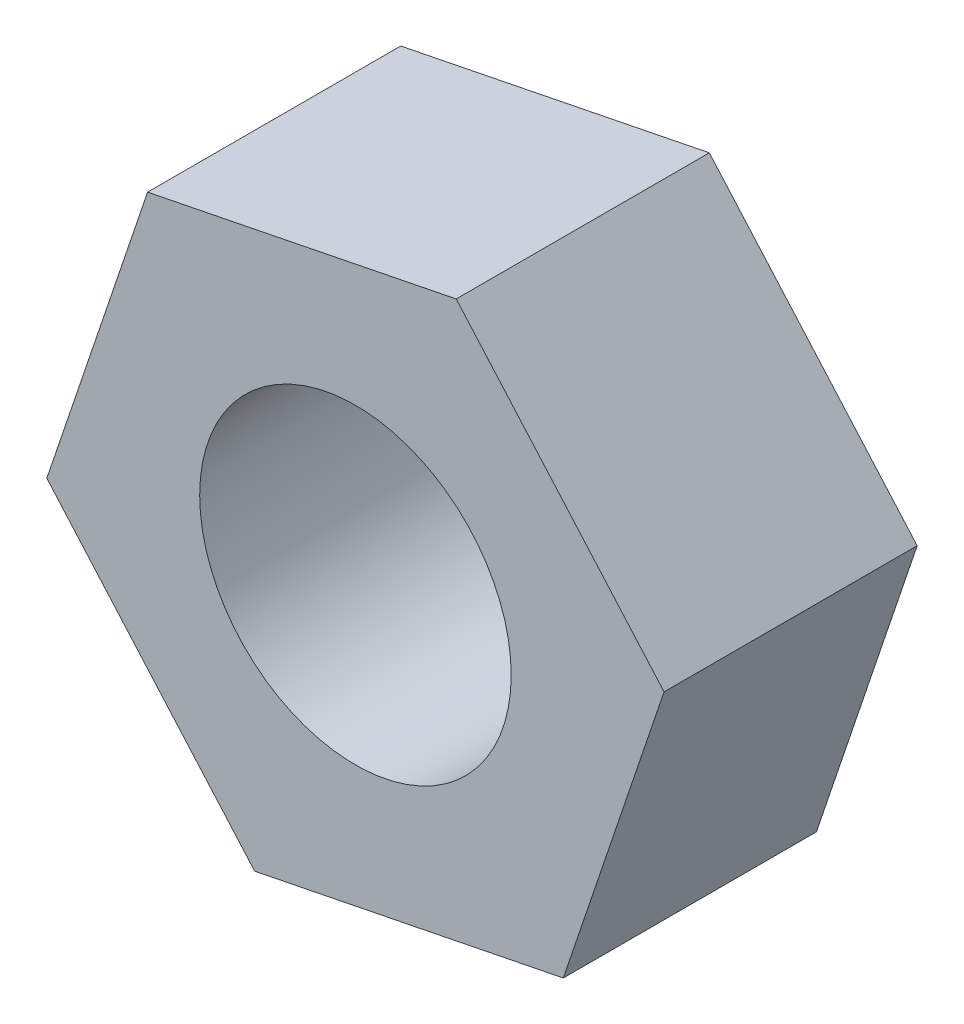
ISO-10303-21;
HEADER;
FILE_DESCRIPTION(('STEP AP214'),'2;1');
FILE_NAME('part.step','',(''),(''),'','','');
FILE_SCHEMA(('AUTOMOTIVE_DESIGN { 1 0 10303 214 1 1 1 1 }'));
ENDSEC;
DATA;
#1=APPLICATION_CONTEXT('core data for automotive mechanical design processes');
#2=APPLICATION_PROTOCOL_DEFINITION('international standard','automotive_design',2000,#1);
#3=PRODUCT_CONTEXT('',#1,'mechanical');
#4=PRODUCT('Part','Part','',(#3));
#5=PRODUCT_RELATED_PRODUCT_CATEGORY('part','',(#4));
#6=PRODUCT_DEFINITION_FORMATION('','',#4);
#7=PRODUCT_DEFINITION_CONTEXT('part definition',#1,'design');
#8=PRODUCT_DEFINITION('design','',#6,#7);
#9=PRODUCT_DEFINITION_SHAPE('','',#8);
#10=(LENGTH_UNIT() NAMED_UNIT(*) SI_UNIT(.MILLI.,.METRE.));
#11=(NAMED_UNIT(*) PLANE_ANGLE_UNIT() SI_UNIT($,.RADIAN.));
#12=(NAMED_UNIT(*) SI_UNIT($,.STERADIAN.) SOLID_ANGLE_UNIT());
#13=UNCERTAINTY_MEASURE_WITH_UNIT(LENGTH_MEASURE(1.E-05),#10,'distance_accuracy_value','');
#14=(GEOMETRIC_REPRESENTATION_CONTEXT(3) GLOBAL_UNCERTAINTY_ASSIGNED_CONTEXT((#13)) GLOBAL_UNIT_ASSIGNED_CONTEXT((#10,
#11,#12)) REPRESENTATION_CONTEXT('',''));
#15=CARTESIAN_POINT('',(0.,0.,0.));
#16=DIRECTION('',(0.,0.,1.));
#17=DIRECTION('',(1.,0.,0.));
#18=AXIS2_PLACEMENT_3D('',#15,#16,#17);
#19=CARTESIAN_POINT('',(420.,-100.000000000005,911.5));
#20=DIRECTION('',(0.,0.,-1.));
#21=DIRECTION('',(-1.,0.,0.));
#22=AXIS2_PLACEMENT_3D('',#19,#20,#21);
#23=PLANE('',#22);
#24=DIRECTION('',(-0.980523085240555,-0.196403867859939,0.));
#25=VECTOR('',#24,1.);
#26=CARTESIAN_POINT('',(425.337563945491,-106.069904814837,911.5));
#27=LINE('',#26,#25);
#28=CARTESIAN_POINT('',(425.337563945491,-106.069904814837,911.5));
#29=VERTEX_POINT('',#28);
#30=CARTESIAN_POINT('',(417.412090204548,-107.657418378541,911.5));
#31=VERTEX_POINT('',#30);
#32=EDGE_CURVE('E112',#29,#31,#27,.T.);
#33=ORIENTED_EDGE('',*,*,#32,.T.);
#34=DIRECTION('',(-0.660352281588506,0.750955966885446,0.));
#35=VECTOR('',#34,1.);
#36=CARTESIAN_POINT('',(417.412090204548,-107.657418378541,911.5));
#37=LINE('',#36,#35);
#38=CARTESIAN_POINT('',(412.074526259056,-101.587513563708,911.5));
#39=VERTEX_POINT('',#38);
#40=EDGE_CURVE('E70',#31,#39,#37,.T.);
#41=ORIENTED_EDGE('',*,*,#40,.T.);
#42=DIRECTION('',(0.320170803652048,0.947359834745384,0.));
#43=VECTOR('',#42,1.);
#44=CARTESIAN_POINT('',(412.074526259056,-101.587513563708,911.5));
#45=LINE('',#44,#43);
#46=CARTESIAN_POINT('',(414.662436054508,-93.9300951851728,911.5));
#47=VERTEX_POINT('',#46);
#48=EDGE_CURVE('E83',#39,#47,#45,.T.);
#49=ORIENTED_EDGE('',*,*,#48,.T.);
#50=DIRECTION('',(0.980523085240555,0.196403867859939,0.));
#51=VECTOR('',#50,1.);
#52=CARTESIAN_POINT('',(414.662436054508,-93.9300951851728,911.5));
#53=LINE('',#52,#51);
#54=CARTESIAN_POINT('',(422.587909795452,-92.3425816214693,911.5));
#55=VERTEX_POINT('',#54);
#56=EDGE_CURVE('E77',#47,#55,#53,.T.);
#57=ORIENTED_EDGE('',*,*,#56,.T.);
#58=DIRECTION('',(0.660352281588506,-0.750955966885446,0.));
#59=VECTOR('',#58,1.);
#60=CARTESIAN_POINT('',(422.587909795452,-92.3425816214693,911.5));
#61=LINE('',#60,#59);
#62=CARTESIAN_POINT('',(427.925473740944,-98.4124864363015,911.5));
#63=VERTEX_POINT('',#62);
#64=EDGE_CURVE('E81',#55,#63,#61,.T.);
#65=ORIENTED_EDGE('',*,*,#64,.T.);
#66=DIRECTION('',(-0.320170803652048,-0.947359834745384,0.));
#67=VECTOR('',#66,1.);
#68=CARTESIAN_POINT('',(427.925473740944,-98.4124864363015,911.5));
#69=LINE('',#68,#67);
#70=EDGE_CURVE('E33',#63,#29,#69,.T.);
#71=ORIENTED_EDGE('',*,*,#70,.T.);
#72=EDGE_LOOP('',(#33,#41,#49,#57,#65,#71));
#73=FACE_BOUND('',#72,.T.);
#74=CARTESIAN_POINT('',(420.,-100.000000000005,911.5));
#75=DIRECTION('',(0.,0.,-1.));
#76=DIRECTION('',(-1.,0.,0.));
#77=AXIS2_PLACEMENT_3D('',#74,#75,#76);
#78=CIRCLE('',#77,4.);
#79=CARTESIAN_POINT('',(416.,-100.000000000005,911.5));
#80=VERTEX_POINT('',#79);
#81=EDGE_CURVE('E105',#80,#80,#78,.T.);
#82=ORIENTED_EDGE('',*,*,#81,.F.);
#83=EDGE_LOOP('',(#82));
#84=FACE_BOUND('',#83,.T.);
#85=ADVANCED_FACE('F16',(#73,#84),#23,.T.);
#86=CARTESIAN_POINT('',(420.,-100.000000000005,918.));
#87=DIRECTION('',(0.,0.,-1.));
#88=DIRECTION('',(-1.,0.,0.));
#89=AXIS2_PLACEMENT_3D('',#86,#87,#88);
#90=PLANE('',#89);
#91=DIRECTION('',(-0.980523085240555,-0.196403867859939,0.));
#92=VECTOR('',#91,1.);
#93=CARTESIAN_POINT('',(425.337563945491,-106.069904814837,918.));
#94=LINE('',#93,#92);
#95=CARTESIAN_POINT('',(425.337563945491,-106.069904814837,918.));
#96=VERTEX_POINT('',#95);
#97=CARTESIAN_POINT('',(417.412090204548,-107.657418378541,918.));
#98=VERTEX_POINT('',#97);
#99=EDGE_CURVE('E101',#96,#98,#94,.T.);
#100=ORIENTED_EDGE('',*,*,#99,.F.);
#101=DIRECTION('',(-0.320170803652048,-0.947359834745384,0.));
#102=VECTOR('',#101,1.);
#103=CARTESIAN_POINT('',(427.925473740944,-98.4124864363015,918.));
#104=LINE('',#103,#102);
#105=CARTESIAN_POINT('',(427.925473740944,-98.4124864363015,918.));
#106=VERTEX_POINT('',#105);
#107=EDGE_CURVE('E62',#106,#96,#104,.T.);
#108=ORIENTED_EDGE('',*,*,#107,.F.);
#109=DIRECTION('',(0.660352281588506,-0.750955966885446,0.));
#110=VECTOR('',#109,1.);
#111=CARTESIAN_POINT('',(422.587909795452,-92.3425816214693,918.));
#112=LINE('',#111,#110);
#113=CARTESIAN_POINT('',(422.587909795452,-92.3425816214693,918.));
#114=VERTEX_POINT('',#113);
#115=EDGE_CURVE('E56',#114,#106,#112,.T.);
#116=ORIENTED_EDGE('',*,*,#115,.F.);
#117=DIRECTION('',(0.980523085240555,0.196403867859939,0.));
#118=VECTOR('',#117,1.);
#119=CARTESIAN_POINT('',(414.662436054508,-93.9300951851728,918.));
#120=LINE('',#119,#118);
#121=CARTESIAN_POINT('',(414.662436054508,-93.9300951851728,918.));
#122=VERTEX_POINT('',#121);
#123=EDGE_CURVE('E91',#122,#114,#120,.T.);
#124=ORIENTED_EDGE('',*,*,#123,.F.);
#125=DIRECTION('',(0.320170803652048,0.947359834745384,0.));
#126=VECTOR('',#125,1.);
#127=CARTESIAN_POINT('',(412.074526259056,-101.587513563708,918.));
#128=LINE('',#127,#126);
#129=CARTESIAN_POINT('',(412.074526259056,-101.587513563708,918.));
#130=VERTEX_POINT('',#129);
#131=EDGE_CURVE('E107',#130,#122,#128,.T.);
#132=ORIENTED_EDGE('',*,*,#131,.F.);
#133=DIRECTION('',(-0.660352281588506,0.750955966885446,0.));
#134=VECTOR('',#133,1.);
#135=CARTESIAN_POINT('',(417.412090204548,-107.657418378541,918.));
#136=LINE('',#135,#134);
#137=EDGE_CURVE('E104',#98,#130,#136,.T.);
#138=ORIENTED_EDGE('',*,*,#137,.F.);
#139=EDGE_LOOP('',(#100,#108,#116,#124,#132,#138));
#140=FACE_BOUND('',#139,.T.);
#141=CARTESIAN_POINT('',(420.,-100.000000000005,918.));
#142=DIRECTION('',(0.,0.,-1.));
#143=DIRECTION('',(-1.,0.,0.));
#144=AXIS2_PLACEMENT_3D('',#141,#142,#143);
#145=CIRCLE('',#144,4.);
#146=CARTESIAN_POINT('',(416.,-100.000000000005,918.));
#147=VERTEX_POINT('',#146);
#148=EDGE_CURVE('E213',#147,#147,#145,.T.);
#149=ORIENTED_EDGE('',*,*,#148,.T.);
#150=EDGE_LOOP('',(#149));
#151=FACE_BOUND('',#150,.T.);
#152=ADVANCED_FACE('F121',(#140,#151),#90,.F.);
#153=CARTESIAN_POINT('',(425.337563945491,-106.069904814837,911.5));
#154=DIRECTION('',(-0.196403867859939,0.980523085240555,0.));
#155=DIRECTION('',(0.980523085240555,0.196403867859939,0.));
#156=AXIS2_PLACEMENT_3D('',#153,#154,#155);
#157=PLANE('',#156);
#158=ORIENTED_EDGE('',*,*,#99,.T.);
#159=DIRECTION('',(0.,0.,1.));
#160=VECTOR('',#159,1.);
#161=CARTESIAN_POINT('',(417.412090204548,-107.657418378541,911.5));
#162=LINE('',#161,#160);
#163=EDGE_CURVE('E11',#31,#98,#162,.T.);
#164=ORIENTED_EDGE('',*,*,#163,.F.);
#165=ORIENTED_EDGE('',*,*,#32,.F.);
#166=DIRECTION('',(0.,0.,1.));
#167=VECTOR('',#166,1.);
#168=CARTESIAN_POINT('',(425.337563945491,-106.069904814837,911.5));
#169=LINE('',#168,#167);
#170=EDGE_CURVE('E97',#29,#96,#169,.T.);
#171=ORIENTED_EDGE('',*,*,#170,.T.);
#172=EDGE_LOOP('',(#158,#164,#165,#171));
#173=FACE_BOUND('',#172,.T.);
#174=ADVANCED_FACE('F18',(#173),#157,.F.);
#175=CARTESIAN_POINT('',(417.412090204548,-107.657418378541,911.5));
#176=DIRECTION('',(0.750955966885446,0.660352281588506,0.));
#177=DIRECTION('',(0.660352281588506,-0.750955966885446,0.));
#178=AXIS2_PLACEMENT_3D('',#175,#176,#177);
#179=PLANE('',#178);
#180=ORIENTED_EDGE('',*,*,#137,.T.);
#181=DIRECTION('',(0.,0.,1.));
#182=VECTOR('',#181,1.);
#183=CARTESIAN_POINT('',(412.074526259056,-101.587513563708,911.5));
#184=LINE('',#183,#182);
#185=EDGE_CURVE('E25',#39,#130,#184,.T.);
#186=ORIENTED_EDGE('',*,*,#185,.F.);
#187=ORIENTED_EDGE('',*,*,#40,.F.);
#188=ORIENTED_EDGE('',*,*,#163,.T.);
#189=EDGE_LOOP('',(#180,#186,#187,#188));
#190=FACE_BOUND('',#189,.T.);
#191=ADVANCED_FACE('F147',(#190),#179,.F.);
#192=CARTESIAN_POINT('',(412.074526259056,-101.587513563708,911.5));
#193=DIRECTION('',(0.947359834745384,-0.320170803652048,0.));
#194=DIRECTION('',(-0.320170803652048,-0.947359834745384,0.));
#195=AXIS2_PLACEMENT_3D('',#192,#193,#194);
#196=PLANE('',#195);
#197=ORIENTED_EDGE('',*,*,#131,.T.);
#198=DIRECTION('',(0.,0.,1.));
#199=VECTOR('',#198,1.);
#200=CARTESIAN_POINT('',(414.662436054508,-93.9300951851728,911.5));
#201=LINE('',#200,#199);
#202=EDGE_CURVE('E92',#47,#122,#201,.T.);
#203=ORIENTED_EDGE('',*,*,#202,.F.);
#204=ORIENTED_EDGE('',*,*,#48,.F.);
#205=ORIENTED_EDGE('',*,*,#185,.T.);
#206=EDGE_LOOP('',(#197,#203,#204,#205));
#207=FACE_BOUND('',#206,.T.);
#208=ADVANCED_FACE('F118',(#207),#196,.F.);
#209=CARTESIAN_POINT('',(414.662436054508,-93.9300951851728,911.5));
#210=DIRECTION('',(0.196403867859939,-0.980523085240555,0.));
#211=DIRECTION('',(-0.980523085240555,-0.196403867859939,0.));
#212=AXIS2_PLACEMENT_3D('',#209,#210,#211);
#213=PLANE('',#212);
#214=ORIENTED_EDGE('',*,*,#123,.T.);
#215=DIRECTION('',(0.,0.,1.));
#216=VECTOR('',#215,1.);
#217=CARTESIAN_POINT('',(422.587909795452,-92.3425816214693,911.5));
#218=LINE('',#217,#216);
#219=EDGE_CURVE('E88',#55,#114,#218,.T.);
#220=ORIENTED_EDGE('',*,*,#219,.F.);
#221=ORIENTED_EDGE('',*,*,#56,.F.);
#222=ORIENTED_EDGE('',*,*,#202,.T.);
#223=EDGE_LOOP('',(#214,#220,#221,#222));
#224=FACE_BOUND('',#223,.T.);
#225=ADVANCED_FACE('F89',(#224),#213,.F.);
#226=CARTESIAN_POINT('',(422.587909795452,-92.3425816214693,911.5));
#227=DIRECTION('',(-0.750955966885446,-0.660352281588506,0.));
#228=DIRECTION('',(-0.660352281588506,0.750955966885446,0.));
#229=AXIS2_PLACEMENT_3D('',#226,#227,#228);
#230=PLANE('',#229);
#231=ORIENTED_EDGE('',*,*,#115,.T.);
#232=DIRECTION('',(0.,0.,1.));
#233=VECTOR('',#232,1.);
#234=CARTESIAN_POINT('',(427.925473740944,-98.4124864363015,911.5));
#235=LINE('',#234,#233);
#236=EDGE_CURVE('E93',#63,#106,#235,.T.);
#237=ORIENTED_EDGE('',*,*,#236,.F.);
#238=ORIENTED_EDGE('',*,*,#64,.F.);
#239=ORIENTED_EDGE('',*,*,#219,.T.);
#240=EDGE_LOOP('',(#231,#237,#238,#239));
#241=FACE_BOUND('',#240,.T.);
#242=ADVANCED_FACE('F95',(#241),#230,.F.);
#243=CARTESIAN_POINT('',(427.925473740944,-98.4124864363015,911.5));
#244=DIRECTION('',(-0.947359834745384,0.320170803652048,0.));
#245=DIRECTION('',(0.320170803652048,0.947359834745384,0.));
#246=AXIS2_PLACEMENT_3D('',#243,#244,#245);
#247=PLANE('',#246);
#248=ORIENTED_EDGE('',*,*,#107,.T.);
#249=ORIENTED_EDGE('',*,*,#170,.F.);
#250=ORIENTED_EDGE('',*,*,#70,.F.);
#251=ORIENTED_EDGE('',*,*,#236,.T.);
#252=EDGE_LOOP('',(#248,#249,#250,#251));
#253=FACE_BOUND('',#252,.T.);
#254=ADVANCED_FACE('F126',(#253),#247,.F.);
#255=CARTESIAN_POINT('',(420.,-100.000000000005,911.5));
#256=DIRECTION('',(0.,0.,1.));
#257=DIRECTION('',(1.,0.,0.));
#258=AXIS2_PLACEMENT_3D('',#255,#256,#257);
#259=CYLINDRICAL_SURFACE('',#258,4.);
#260=ORIENTED_EDGE('',*,*,#81,.T.);
#261=EDGE_LOOP('',(#260));
#262=FACE_BOUND('',#261,.T.);
#263=ORIENTED_EDGE('',*,*,#148,.F.);
#264=EDGE_LOOP('',(#263));
#265=FACE_BOUND('',#264,.T.);
#266=ADVANCED_FACE('F128',(#262,#265),#259,.F.);
#267=CLOSED_SHELL('',(#85,#152,#174,#191,#208,#225,#242,#254,#266));
#268=MANIFOLD_SOLID_BREP('B1',#267);
#269=ADVANCED_BREP_SHAPE_REPRESENTATION('',(#18,#268),#14);
#270=SHAPE_DEFINITION_REPRESENTATION(#9,#269);
ENDSEC;
END-ISO-10303-21;
